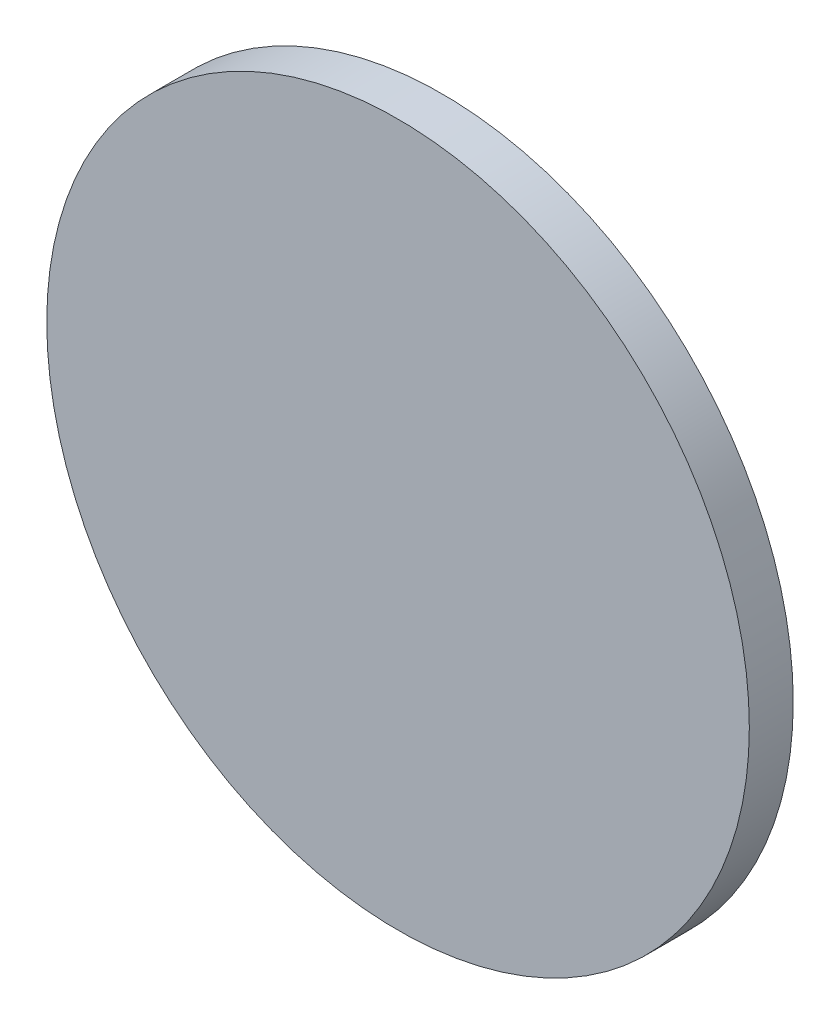
ISO-10303-21;
HEADER;
FILE_DESCRIPTION(('STEP AP214'),'2;1');
FILE_NAME('part.step','',(''),(''),'','','');
FILE_SCHEMA(('AUTOMOTIVE_DESIGN { 1 0 10303 214 1 1 1 1 }'));
ENDSEC;
DATA;
#1=APPLICATION_CONTEXT('core data for automotive mechanical design processes');
#2=APPLICATION_PROTOCOL_DEFINITION('international standard','automotive_design',2000,#1);
#3=PRODUCT_CONTEXT('',#1,'mechanical');
#4=PRODUCT('Part','Part','',(#3));
#5=PRODUCT_RELATED_PRODUCT_CATEGORY('part','',(#4));
#6=PRODUCT_DEFINITION_FORMATION('','',#4);
#7=PRODUCT_DEFINITION_CONTEXT('part definition',#1,'design');
#8=PRODUCT_DEFINITION('design','',#6,#7);
#9=PRODUCT_DEFINITION_SHAPE('','',#8);
#10=(LENGTH_UNIT() NAMED_UNIT(*) SI_UNIT(.MILLI.,.METRE.));
#11=(NAMED_UNIT(*) PLANE_ANGLE_UNIT() SI_UNIT($,.RADIAN.));
#12=(NAMED_UNIT(*) SI_UNIT($,.STERADIAN.) SOLID_ANGLE_UNIT());
#13=UNCERTAINTY_MEASURE_WITH_UNIT(LENGTH_MEASURE(1.E-05),#10,'distance_accuracy_value','');
#14=(GEOMETRIC_REPRESENTATION_CONTEXT(3) GLOBAL_UNCERTAINTY_ASSIGNED_CONTEXT((#13)) GLOBAL_UNIT_ASSIGNED_CONTEXT((#10,
#11,#12)) REPRESENTATION_CONTEXT('',''));
#15=CARTESIAN_POINT('',(0.,0.,0.));
#16=DIRECTION('',(0.,0.,1.));
#17=DIRECTION('',(1.,0.,0.));
#18=AXIS2_PLACEMENT_3D('',#15,#16,#17);
#19=CARTESIAN_POINT('',(0.,0.,0.75));
#20=DIRECTION('',(0.,0.,1.));
#21=DIRECTION('',(1.,0.,0.));
#22=AXIS2_PLACEMENT_3D('',#19,#20,#21);
#23=PLANE('',#22);
#24=CARTESIAN_POINT('',(0.,0.,0.75));
#25=DIRECTION('',(0.,0.,1.));
#26=DIRECTION('',(1.,0.,0.));
#27=AXIS2_PLACEMENT_3D('',#24,#25,#26);
#28=CIRCLE('',#27,6.);
#29=CARTESIAN_POINT('',(6.,0.,0.75));
#30=VERTEX_POINT('',#29);
#31=EDGE_CURVE('E18',#30,#30,#28,.F.);
#32=ORIENTED_EDGE('',*,*,#31,.F.);
#33=EDGE_LOOP('',(#32));
#34=FACE_BOUND('',#33,.T.);
#35=ADVANCED_FACE('F15',(#34),#23,.T.);
#36=CARTESIAN_POINT('',(0.,0.,0.));
#37=DIRECTION('',(0.,0.,1.));
#38=DIRECTION('',(1.,0.,0.));
#39=AXIS2_PLACEMENT_3D('',#36,#37,#38);
#40=CYLINDRICAL_SURFACE('',#39,6.);
#41=ORIENTED_EDGE('',*,*,#31,.T.);
#42=EDGE_LOOP('',(#41));
#43=FACE_BOUND('',#42,.T.);
#44=CARTESIAN_POINT('',(0.,0.,0.));
#45=DIRECTION('',(0.,0.,1.));
#46=DIRECTION('',(1.,0.,0.));
#47=AXIS2_PLACEMENT_3D('',#44,#45,#46);
#48=CIRCLE('',#47,6.);
#49=CARTESIAN_POINT('',(6.,0.,0.));
#50=VERTEX_POINT('',#49);
#51=EDGE_CURVE('E10',#50,#50,#48,.T.);
#52=ORIENTED_EDGE('',*,*,#51,.T.);
#53=EDGE_LOOP('',(#52));
#54=FACE_BOUND('',#53,.T.);
#55=ADVANCED_FACE('F27',(#43,#54),#40,.T.);
#56=CARTESIAN_POINT('',(0.,0.,0.));
#57=DIRECTION('',(0.,0.,1.));
#58=DIRECTION('',(1.,0.,0.));
#59=AXIS2_PLACEMENT_3D('',#56,#57,#58);
#60=PLANE('',#59);
#61=ORIENTED_EDGE('',*,*,#51,.F.);
#62=EDGE_LOOP('',(#61));
#63=FACE_BOUND('',#62,.T.);
#64=ADVANCED_FACE('F34',(#63),#60,.F.);
#65=CLOSED_SHELL('',(#35,#55,#64));
#66=MANIFOLD_SOLID_BREP('B1',#65);
#67=ADVANCED_BREP_SHAPE_REPRESENTATION('',(#18,#66),#14);
#68=SHAPE_DEFINITION_REPRESENTATION(#9,#67);
ENDSEC;
END-ISO-10303-21;
